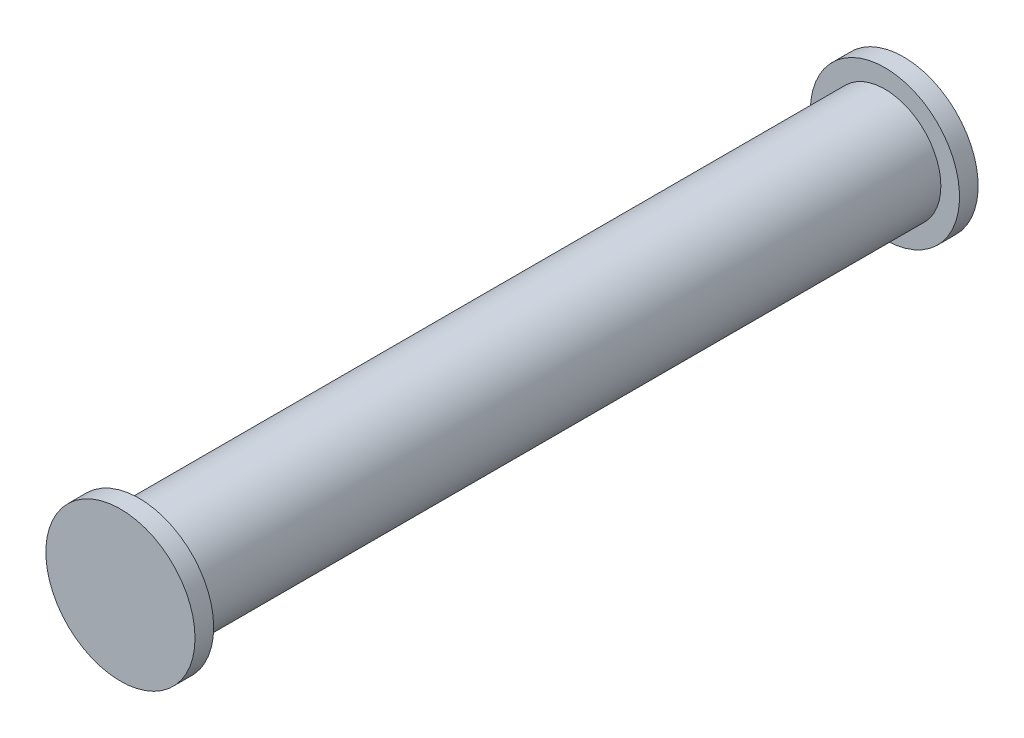
ISO-10303-21;
HEADER;
FILE_DESCRIPTION(('STEP AP214'),'2;1');
FILE_NAME('part.step','',(''),(''),'','','');
FILE_SCHEMA(('AUTOMOTIVE_DESIGN { 1 0 10303 214 1 1 1 1 }'));
ENDSEC;
DATA;
#1=APPLICATION_CONTEXT('core data for automotive mechanical design processes');
#2=APPLICATION_PROTOCOL_DEFINITION('international standard','automotive_design',2000,#1);
#3=PRODUCT_CONTEXT('',#1,'mechanical');
#4=PRODUCT('Part','Part','',(#3));
#5=PRODUCT_RELATED_PRODUCT_CATEGORY('part','',(#4));
#6=PRODUCT_DEFINITION_FORMATION('','',#4);
#7=PRODUCT_DEFINITION_CONTEXT('part definition',#1,'design');
#8=PRODUCT_DEFINITION('design','',#6,#7);
#9=PRODUCT_DEFINITION_SHAPE('','',#8);
#10=(LENGTH_UNIT() NAMED_UNIT(*) SI_UNIT(.MILLI.,.METRE.));
#11=(NAMED_UNIT(*) PLANE_ANGLE_UNIT() SI_UNIT($,.RADIAN.));
#12=(NAMED_UNIT(*) SI_UNIT($,.STERADIAN.) SOLID_ANGLE_UNIT());
#13=UNCERTAINTY_MEASURE_WITH_UNIT(LENGTH_MEASURE(1.E-05),#10,'distance_accuracy_value','');
#14=(GEOMETRIC_REPRESENTATION_CONTEXT(3) GLOBAL_UNCERTAINTY_ASSIGNED_CONTEXT((#13)) GLOBAL_UNIT_ASSIGNED_CONTEXT((#10,
#11,#12)) REPRESENTATION_CONTEXT('',''));
#15=CARTESIAN_POINT('',(0.,0.,0.));
#16=DIRECTION('',(0.,0.,1.));
#17=DIRECTION('',(1.,0.,0.));
#18=AXIS2_PLACEMENT_3D('',#15,#16,#17);
#19=CARTESIAN_POINT('',(0.,0.,254.));
#20=DIRECTION('',(0.,0.,-1.));
#21=DIRECTION('',(-1.,0.,0.));
#22=AXIS2_PLACEMENT_3D('',#19,#20,#21);
#23=CYLINDRICAL_SURFACE('',#22,19.05);
#24=CARTESIAN_POINT('',(0.,0.,254.));
#25=DIRECTION('',(0.,0.,1.));
#26=DIRECTION('',(1.,0.,0.));
#27=AXIS2_PLACEMENT_3D('',#24,#25,#26);
#28=CIRCLE('',#27,19.05);
#29=CARTESIAN_POINT('',(19.05,0.,254.));
#30=VERTEX_POINT('',#29);
#31=EDGE_CURVE('E10',#30,#30,#28,.T.);
#32=ORIENTED_EDGE('',*,*,#31,.F.);
#33=EDGE_LOOP('',(#32));
#34=FACE_BOUND('',#33,.T.);
#35=CARTESIAN_POINT('',(0.,0.,0.));
#36=DIRECTION('',(0.,0.,1.));
#37=DIRECTION('',(1.,0.,0.));
#38=AXIS2_PLACEMENT_3D('',#35,#36,#37);
#39=CIRCLE('',#38,19.05);
#40=CARTESIAN_POINT('',(19.05,0.,0.));
#41=VERTEX_POINT('',#40);
#42=EDGE_CURVE('E34',#41,#41,#39,.T.);
#43=ORIENTED_EDGE('',*,*,#42,.T.);
#44=EDGE_LOOP('',(#43));
#45=FACE_BOUND('',#44,.T.);
#46=ADVANCED_FACE('F31',(#34,#45),#23,.T.);
#47=CARTESIAN_POINT('',(0.,0.,260.35));
#48=DIRECTION('',(0.,0.,-1.));
#49=DIRECTION('',(-1.,0.,0.));
#50=AXIS2_PLACEMENT_3D('',#47,#48,#49);
#51=CYLINDRICAL_SURFACE('',#50,25.4);
#52=CARTESIAN_POINT('',(0.,0.,260.35));
#53=DIRECTION('',(0.,0.,1.));
#54=DIRECTION('',(1.,0.,0.));
#55=AXIS2_PLACEMENT_3D('',#52,#53,#54);
#56=CIRCLE('',#55,25.4);
#57=CARTESIAN_POINT('',(25.4,0.,260.35));
#58=VERTEX_POINT('',#57);
#59=EDGE_CURVE('E38',#58,#58,#56,.T.);
#60=ORIENTED_EDGE('',*,*,#59,.F.);
#61=EDGE_LOOP('',(#60));
#62=FACE_BOUND('',#61,.T.);
#63=CARTESIAN_POINT('',(0.,0.,254.));
#64=DIRECTION('',(0.,0.,1.));
#65=DIRECTION('',(1.,0.,0.));
#66=AXIS2_PLACEMENT_3D('',#63,#64,#65);
#67=CIRCLE('',#66,25.4);
#68=CARTESIAN_POINT('',(25.4,0.,254.));
#69=VERTEX_POINT('',#68);
#70=EDGE_CURVE('E42',#69,#69,#67,.T.);
#71=ORIENTED_EDGE('',*,*,#70,.T.);
#72=EDGE_LOOP('',(#71));
#73=FACE_BOUND('',#72,.T.);
#74=ADVANCED_FACE('F79',(#62,#73),#51,.T.);
#75=CARTESIAN_POINT('',(0.,0.,260.35));
#76=DIRECTION('',(0.,0.,1.));
#77=DIRECTION('',(1.,0.,0.));
#78=AXIS2_PLACEMENT_3D('',#75,#76,#77);
#79=PLANE('',#78);
#80=ORIENTED_EDGE('',*,*,#59,.T.);
#81=EDGE_LOOP('',(#80));
#82=FACE_BOUND('',#81,.T.);
#83=ADVANCED_FACE('F75',(#82),#79,.T.);
#84=CARTESIAN_POINT('',(0.,0.,254.));
#85=DIRECTION('',(0.,0.,1.));
#86=DIRECTION('',(1.,0.,0.));
#87=AXIS2_PLACEMENT_3D('',#84,#85,#86);
#88=PLANE('',#87);
#89=ORIENTED_EDGE('',*,*,#31,.T.);
#90=EDGE_LOOP('',(#89));
#91=FACE_BOUND('',#90,.T.);
#92=ORIENTED_EDGE('',*,*,#70,.F.);
#93=EDGE_LOOP('',(#92));
#94=FACE_BOUND('',#93,.T.);
#95=ADVANCED_FACE('F67',(#91,#94),#88,.F.);
#96=CARTESIAN_POINT('',(0.,0.,-6.35));
#97=DIRECTION('',(0.,0.,1.));
#98=DIRECTION('',(1.,0.,0.));
#99=AXIS2_PLACEMENT_3D('',#96,#97,#98);
#100=CYLINDRICAL_SURFACE('',#99,25.4);
#101=CARTESIAN_POINT('',(0.,0.,-6.35));
#102=DIRECTION('',(0.,0.,-1.));
#103=DIRECTION('',(-1.,0.,0.));
#104=AXIS2_PLACEMENT_3D('',#101,#102,#103);
#105=CIRCLE('',#104,25.4);
#106=CARTESIAN_POINT('',(-25.4,0.,-6.35));
#107=VERTEX_POINT('',#106);
#108=EDGE_CURVE('E50',#107,#107,#105,.T.);
#109=ORIENTED_EDGE('',*,*,#108,.F.);
#110=EDGE_LOOP('',(#109));
#111=FACE_BOUND('',#110,.T.);
#112=CARTESIAN_POINT('',(0.,0.,0.));
#113=DIRECTION('',(0.,0.,-1.));
#114=DIRECTION('',(-1.,0.,0.));
#115=AXIS2_PLACEMENT_3D('',#112,#113,#114);
#116=CIRCLE('',#115,25.4);
#117=CARTESIAN_POINT('',(-25.4,0.,0.));
#118=VERTEX_POINT('',#117);
#119=EDGE_CURVE('E47',#118,#118,#116,.T.);
#120=ORIENTED_EDGE('',*,*,#119,.T.);
#121=EDGE_LOOP('',(#120));
#122=FACE_BOUND('',#121,.T.);
#123=ADVANCED_FACE('F65',(#111,#122),#100,.T.);
#124=CARTESIAN_POINT('',(0.,0.,-6.35));
#125=DIRECTION('',(0.,0.,-1.));
#126=DIRECTION('',(-1.,0.,0.));
#127=AXIS2_PLACEMENT_3D('',#124,#125,#126);
#128=PLANE('',#127);
#129=ORIENTED_EDGE('',*,*,#108,.T.);
#130=EDGE_LOOP('',(#129));
#131=FACE_BOUND('',#130,.T.);
#132=ADVANCED_FACE('F61',(#131),#128,.T.);
#133=CARTESIAN_POINT('',(0.,0.,0.));
#134=DIRECTION('',(0.,0.,-1.));
#135=DIRECTION('',(-1.,0.,0.));
#136=AXIS2_PLACEMENT_3D('',#133,#134,#135);
#137=PLANE('',#136);
#138=ORIENTED_EDGE('',*,*,#42,.F.);
#139=EDGE_LOOP('',(#138));
#140=FACE_BOUND('',#139,.T.);
#141=ORIENTED_EDGE('',*,*,#119,.F.);
#142=EDGE_LOOP('',(#141));
#143=FACE_BOUND('',#142,.T.);
#144=ADVANCED_FACE('F58',(#140,#143),#137,.F.);
#145=CLOSED_SHELL('',(#46,#74,#83,#95,#123,#132,#144));
#146=MANIFOLD_SOLID_BREP('B2',#145);
#147=ADVANCED_BREP_SHAPE_REPRESENTATION('',(#18,#146),#14);
#148=SHAPE_DEFINITION_REPRESENTATION(#9,#147);
ENDSEC;
END-ISO-10303-21;
